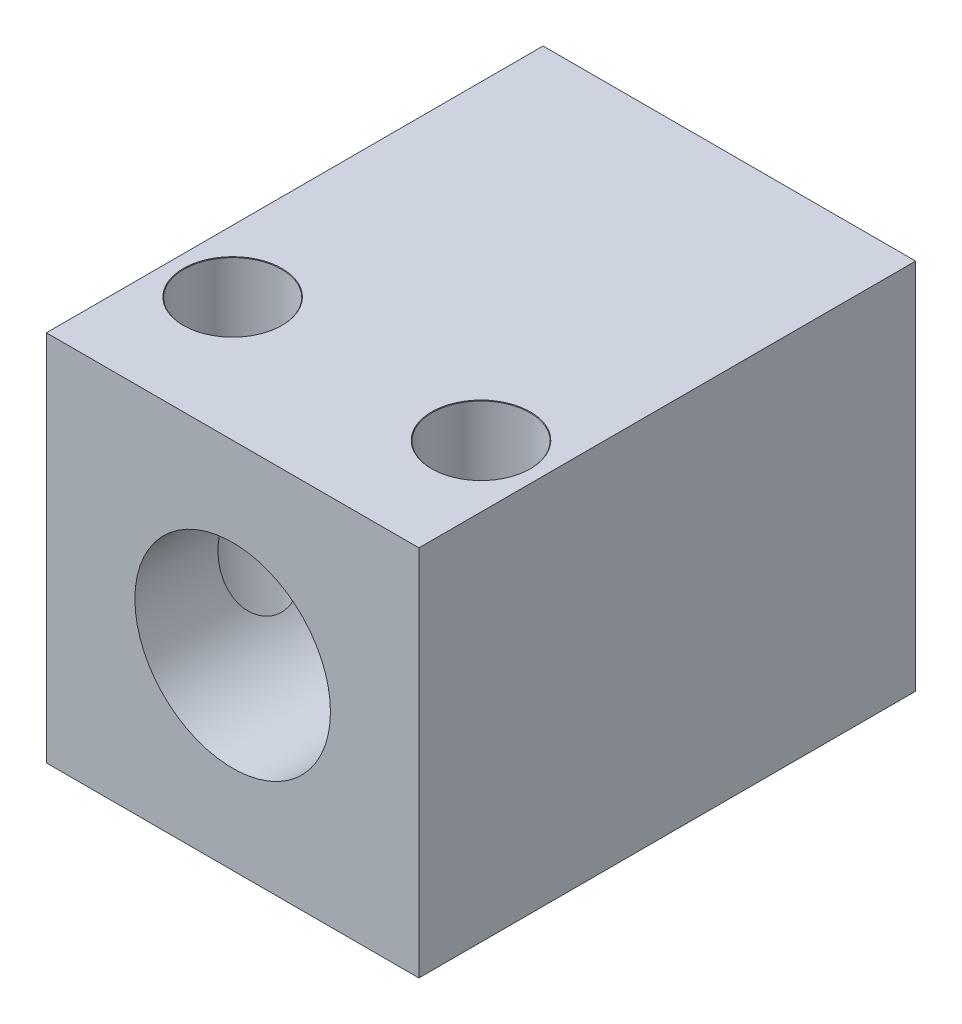
ISO-10303-21;
HEADER;
FILE_DESCRIPTION(('STEP AP214'),'2;1');
FILE_NAME('part.step','',(''),(''),'','','');
FILE_SCHEMA(('AUTOMOTIVE_DESIGN { 1 0 10303 214 1 1 1 1 }'));
ENDSEC;
DATA;
#1=APPLICATION_CONTEXT('core data for automotive mechanical design processes');
#2=APPLICATION_PROTOCOL_DEFINITION('international standard','automotive_design',2000,#1);
#3=PRODUCT_CONTEXT('',#1,'mechanical');
#4=PRODUCT('Part','Part','',(#3));
#5=PRODUCT_RELATED_PRODUCT_CATEGORY('part','',(#4));
#6=PRODUCT_DEFINITION_FORMATION('','',#4);
#7=PRODUCT_DEFINITION_CONTEXT('part definition',#1,'design');
#8=PRODUCT_DEFINITION('design','',#6,#7);
#9=PRODUCT_DEFINITION_SHAPE('','',#8);
#10=(LENGTH_UNIT() NAMED_UNIT(*) SI_UNIT(.MILLI.,.METRE.));
#11=(NAMED_UNIT(*) PLANE_ANGLE_UNIT() SI_UNIT($,.RADIAN.));
#12=(NAMED_UNIT(*) SI_UNIT($,.STERADIAN.) SOLID_ANGLE_UNIT());
#13=UNCERTAINTY_MEASURE_WITH_UNIT(LENGTH_MEASURE(1.E-05),#10,'distance_accuracy_value','');
#14=(GEOMETRIC_REPRESENTATION_CONTEXT(3) GLOBAL_UNCERTAINTY_ASSIGNED_CONTEXT((#13)) GLOBAL_UNIT_ASSIGNED_CONTEXT((#10,
#11,#12)) REPRESENTATION_CONTEXT('',''));
#15=CARTESIAN_POINT('',(0.,0.,0.));
#16=DIRECTION('',(0.,0.,1.));
#17=DIRECTION('',(1.,0.,0.));
#18=AXIS2_PLACEMENT_3D('',#15,#16,#17);
#19=CARTESIAN_POINT('',(0.,93.345,-685.8));
#20=DIRECTION('',(0.,1.,0.));
#21=DIRECTION('',(0.,0.,1.));
#22=AXIS2_PLACEMENT_3D('',#19,#20,#21);
#23=PLANE('',#22);
#24=CARTESIAN_POINT('',(57.15,93.345,-692.15));
#25=DIRECTION('',(0.,1.,0.));
#26=DIRECTION('',(0.,0.,1.));
#27=AXIS2_PLACEMENT_3D('',#24,#25,#26);
#28=CIRCLE('',#27,2.525);
#29=CARTESIAN_POINT('',(57.15,93.345,-689.625));
#30=VERTEX_POINT('',#29);
#31=EDGE_CURVE('E164',#30,#30,#28,.T.);
#32=ORIENTED_EDGE('',*,*,#31,.F.);
#33=EDGE_LOOP('',(#32));
#34=FACE_BOUND('',#33,.T.);
#35=CARTESIAN_POINT('',(69.85,93.345,-692.15));
#36=DIRECTION('',(0.,1.,0.));
#37=DIRECTION('',(0.,0.,1.));
#38=AXIS2_PLACEMENT_3D('',#35,#36,#37);
#39=CIRCLE('',#38,2.525);
#40=CARTESIAN_POINT('',(69.85,93.345,-689.625));
#41=VERTEX_POINT('',#40);
#42=EDGE_CURVE('E176',#41,#41,#39,.T.);
#43=ORIENTED_EDGE('',*,*,#42,.F.);
#44=EDGE_LOOP('',(#43));
#45=FACE_BOUND('',#44,.T.);
#46=DIRECTION('',(1.,0.,0.));
#47=VECTOR('',#46,1.);
#48=CARTESIAN_POINT('',(0.,93.345,-711.2));
#49=LINE('',#48,#47);
#50=CARTESIAN_POINT('',(53.975,93.345,-711.2));
#51=VERTEX_POINT('',#50);
#52=CARTESIAN_POINT('',(73.025,93.345,-711.2));
#53=VERTEX_POINT('',#52);
#54=EDGE_CURVE('E211',#51,#53,#49,.T.);
#55=ORIENTED_EDGE('',*,*,#54,.F.);
#56=DIRECTION('',(0.,0.,-1.));
#57=VECTOR('',#56,1.);
#58=CARTESIAN_POINT('',(53.975,93.345,-685.8));
#59=LINE('',#58,#57);
#60=CARTESIAN_POINT('',(53.975,93.345,-685.8));
#61=VERTEX_POINT('',#60);
#62=EDGE_CURVE('E11',#61,#51,#59,.T.);
#63=ORIENTED_EDGE('',*,*,#62,.F.);
#64=DIRECTION('',(1.,0.,0.));
#65=VECTOR('',#64,1.);
#66=CARTESIAN_POINT('',(0.,93.345,-685.8));
#67=LINE('',#66,#65);
#68=CARTESIAN_POINT('',(73.025,93.345,-685.8));
#69=VERTEX_POINT('',#68);
#70=EDGE_CURVE('E194',#61,#69,#67,.T.);
#71=ORIENTED_EDGE('',*,*,#70,.T.);
#72=DIRECTION('',(0.,0.,-1.));
#73=VECTOR('',#72,1.);
#74=CARTESIAN_POINT('',(73.025,93.345,-685.8));
#75=LINE('',#74,#73);
#76=EDGE_CURVE('E72',#69,#53,#75,.T.);
#77=ORIENTED_EDGE('',*,*,#76,.T.);
#78=EDGE_LOOP('',(#55,#63,#71,#77));
#79=FACE_BOUND('',#78,.T.);
#80=ADVANCED_FACE('F47',(#34,#45,#79),#23,.T.);
#81=CARTESIAN_POINT('',(53.975,0.,-685.8));
#82=DIRECTION('',(1.,0.,0.));
#83=DIRECTION('',(0.,0.,-1.));
#84=AXIS2_PLACEMENT_3D('',#81,#82,#83);
#85=PLANE('',#84);
#86=DIRECTION('',(0.,-1.,0.));
#87=VECTOR('',#86,1.);
#88=CARTESIAN_POINT('',(53.975,0.,-711.2));
#89=LINE('',#88,#87);
#90=CARTESIAN_POINT('',(53.975,74.295,-711.2));
#91=VERTEX_POINT('',#90);
#92=EDGE_CURVE('E214',#51,#91,#89,.T.);
#93=ORIENTED_EDGE('',*,*,#92,.T.);
#94=DIRECTION('',(0.,0.,-1.));
#95=VECTOR('',#94,1.);
#96=CARTESIAN_POINT('',(53.975,74.295,-685.8));
#97=LINE('',#96,#95);
#98=CARTESIAN_POINT('',(53.975,74.295,-685.8));
#99=VERTEX_POINT('',#98);
#100=EDGE_CURVE('E63',#99,#91,#97,.T.);
#101=ORIENTED_EDGE('',*,*,#100,.F.);
#102=DIRECTION('',(0.,-1.,0.));
#103=VECTOR('',#102,1.);
#104=CARTESIAN_POINT('',(53.975,0.,-685.8));
#105=LINE('',#104,#103);
#106=EDGE_CURVE('E198',#61,#99,#105,.T.);
#107=ORIENTED_EDGE('',*,*,#106,.F.);
#108=ORIENTED_EDGE('',*,*,#62,.T.);
#109=EDGE_LOOP('',(#93,#101,#107,#108));
#110=FACE_BOUND('',#109,.T.);
#111=ADVANCED_FACE('F257',(#110),#85,.F.);
#112=CARTESIAN_POINT('',(0.,74.295,-685.8));
#113=DIRECTION('',(0.,1.,0.));
#114=DIRECTION('',(0.,0.,1.));
#115=AXIS2_PLACEMENT_3D('',#112,#113,#114);
#116=PLANE('',#115);
#117=CARTESIAN_POINT('',(57.15,74.295,-692.15));
#118=DIRECTION('',(0.,1.,0.));
#119=DIRECTION('',(0.,0.,1.));
#120=AXIS2_PLACEMENT_3D('',#117,#118,#119);
#121=CIRCLE('',#120,2.49999999999999);
#122=CARTESIAN_POINT('',(57.15,74.295,-689.65));
#123=VERTEX_POINT('',#122);
#124=EDGE_CURVE('E172',#123,#123,#121,.T.);
#125=ORIENTED_EDGE('',*,*,#124,.T.);
#126=EDGE_LOOP('',(#125));
#127=FACE_BOUND('',#126,.T.);
#128=CARTESIAN_POINT('',(69.85,74.295,-692.15));
#129=DIRECTION('',(0.,1.,0.));
#130=DIRECTION('',(0.,0.,1.));
#131=AXIS2_PLACEMENT_3D('',#128,#129,#130);
#132=CIRCLE('',#131,2.49999999999999);
#133=CARTESIAN_POINT('',(69.85,74.295,-689.65));
#134=VERTEX_POINT('',#133);
#135=EDGE_CURVE('E185',#134,#134,#132,.T.);
#136=ORIENTED_EDGE('',*,*,#135,.T.);
#137=EDGE_LOOP('',(#136));
#138=FACE_BOUND('',#137,.T.);
#139=DIRECTION('',(1.,0.,0.));
#140=VECTOR('',#139,1.);
#141=CARTESIAN_POINT('',(0.,74.295,-711.2));
#142=LINE('',#141,#140);
#143=CARTESIAN_POINT('',(73.025,74.295,-711.2));
#144=VERTEX_POINT('',#143);
#145=EDGE_CURVE('E218',#91,#144,#142,.T.);
#146=ORIENTED_EDGE('',*,*,#145,.T.);
#147=DIRECTION('',(0.,0.,-1.));
#148=VECTOR('',#147,1.);
#149=CARTESIAN_POINT('',(73.025,74.295,-685.8));
#150=LINE('',#149,#148);
#151=CARTESIAN_POINT('',(73.025,74.295,-685.8));
#152=VERTEX_POINT('',#151);
#153=EDGE_CURVE('E87',#152,#144,#150,.T.);
#154=ORIENTED_EDGE('',*,*,#153,.F.);
#155=DIRECTION('',(1.,0.,0.));
#156=VECTOR('',#155,1.);
#157=CARTESIAN_POINT('',(0.,74.295,-685.8));
#158=LINE('',#157,#156);
#159=EDGE_CURVE('E202',#99,#152,#158,.T.);
#160=ORIENTED_EDGE('',*,*,#159,.F.);
#161=ORIENTED_EDGE('',*,*,#100,.T.);
#162=EDGE_LOOP('',(#146,#154,#160,#161));
#163=FACE_BOUND('',#162,.T.);
#164=ADVANCED_FACE('F254',(#127,#138,#163),#116,.F.);
#165=CARTESIAN_POINT('',(63.5,83.82,-685.8));
#166=DIRECTION('',(0.,0.,-1.));
#167=DIRECTION('',(-1.,0.,0.));
#168=AXIS2_PLACEMENT_3D('',#165,#166,#167);
#169=CYLINDRICAL_SURFACE('',#168,5.00000000000001);
#170=CARTESIAN_POINT('',(58.5,83.82,-690.04583745875));
#171=CARTESIAN_POINT('',(58.4999989774672,83.714213545151,-690.045839970916));
#172=CARTESIAN_POINT('',(58.5033593214814,83.6084419302891,-690.047982295149));
#173=CARTESIAN_POINT('',(58.5167644076017,83.3974684740138,-690.056671842969));
#174=CARTESIAN_POINT('',(58.5268107384981,83.2922667740209,-690.063220113543));
#175=CARTESIAN_POINT('',(58.5534874476869,83.0830135197032,-690.081067914394));
#176=CARTESIAN_POINT('',(58.5701234824508,82.9789630326395,-690.09237152708));
#177=CARTESIAN_POINT('',(58.6097633373426,82.7728163415862,-690.120300261963));
#178=CARTESIAN_POINT('',(58.6327656053745,82.6707196677327,-690.136924087239));
#179=CARTESIAN_POINT('',(58.6799118026842,82.4881197584404,-690.172610548589));
#180=CARTESIAN_POINT('',(58.7030374058769,82.4071495674642,-690.190635391782));
#181=CARTESIAN_POINT('',(58.7529661046161,82.2475311850245,-690.231266899094));
#182=CARTESIAN_POINT('',(58.7797684642517,82.1688825327184,-690.253872646765));
#183=CARTESIAN_POINT('',(58.8366094270354,82.0145821831999,-690.304251127018));
#184=CARTESIAN_POINT('',(58.8666433361218,81.9389263516115,-690.332016406541));
#185=CARTESIAN_POINT('',(58.9293916836324,81.7912106537287,-690.393387232573));
#186=CARTESIAN_POINT('',(58.9621052462904,81.7191496248688,-690.426990874977));
#187=CARTESIAN_POINT('',(59.0454762702973,81.5461815121693,-690.518249815511));
#188=CARTESIAN_POINT('',(59.097287632407,81.4477964772423,-690.579754737754));
#189=CARTESIAN_POINT('',(59.2016464277976,81.263567652712,-690.718824518529));
#190=CARTESIAN_POINT('',(59.2541927677179,81.1777070383515,-690.79636748705));
#191=CARTESIAN_POINT('',(59.3461720823886,81.035839710185,-690.952713217435));
#192=CARTESIAN_POINT('',(59.3862606531168,80.9772416101752,-691.028765248821));
#193=CARTESIAN_POINT('',(59.4607046829431,80.8724193856106,-691.191545771931));
#194=CARTESIAN_POINT('',(59.4950618080349,80.8261916629152,-691.278271148389));
#195=CARTESIAN_POINT('',(59.5551809861293,80.747395827986,-691.461218165204));
#196=CARTESIAN_POINT('',(59.5808901329381,80.7149114936918,-691.557493753863));
#197=CARTESIAN_POINT('',(59.6208597668046,80.6651128389882,-691.756175704769));
#198=CARTESIAN_POINT('',(59.6351248702689,80.647792401365,-691.858579576997));
#199=CARTESIAN_POINT('',(59.6499051883666,80.6298776217754,-692.054645065697));
#200=CARTESIAN_POINT('',(59.651730720185,80.6276889679153,-692.148066719959));
#201=CARTESIAN_POINT('',(59.6449549876982,80.6358740222636,-692.333955098434));
#202=CARTESIAN_POINT('',(59.6363571086923,80.6462436518109,-692.426422122855));
#203=CARTESIAN_POINT('',(59.6099182716733,80.6787143163069,-692.604583173049));
#204=CARTESIAN_POINT('',(59.5923987564821,80.7004079901533,-692.690400445237));
#205=CARTESIAN_POINT('',(59.5496455782865,80.7547288100059,-692.856438222014));
#206=CARTESIAN_POINT('',(59.5244116259869,80.7873563660429,-692.936658516576));
#207=CARTESIAN_POINT('',(59.4666585971674,80.8645681832631,-693.093623606251));
#208=CARTESIAN_POINT('',(59.4338454473922,80.9096557805827,-693.170010905675));
#209=CARTESIAN_POINT('',(59.3640356400811,81.0097458801378,-693.313808166226));
#210=CARTESIAN_POINT('',(59.3270369773188,81.0647531423207,-693.38121379038));
#211=CARTESIAN_POINT('',(59.235875625208,81.20716369627,-693.531915457981));
#212=CARTESIAN_POINT('',(59.1807817872897,81.2987105074255,-693.610737943689));
#213=CARTESIAN_POINT('',(59.0720314848236,81.4949790961469,-693.751167905875));
#214=CARTESIAN_POINT('',(59.0183781180215,81.5997268777275,-693.812740609303));
#215=CARTESIAN_POINT('',(58.9325077690338,81.784105272211,-693.903631982223));
#216=CARTESIAN_POINT('',(58.8988903189244,81.8611612240619,-693.936986023354));
#217=CARTESIAN_POINT('',(58.8348543558828,82.018983427362,-693.997487461479));
#218=CARTESIAN_POINT('',(58.8044369671571,82.0997509684991,-694.02463268117));
#219=CARTESIAN_POINT('',(58.7473794144433,82.2643023940694,-694.073483987691));
#220=CARTESIAN_POINT('',(58.7207435662942,82.3480895902743,-694.095183881146));
#221=CARTESIAN_POINT('',(58.6716918675943,82.5179776221962,-694.133790932561));
#222=CARTESIAN_POINT('',(58.6492769194497,82.6040789481759,-694.150697066031));
#223=CARTESIAN_POINT('',(58.6035853984843,82.8012242103544,-694.184231850606));
#224=CARTESIAN_POINT('',(58.5816698852162,82.9128026559503,-694.19958691147));
#225=CARTESIAN_POINT('',(58.5454406701975,83.1378408643618,-694.22442156404));
#226=CARTESIAN_POINT('',(58.5311288610601,83.2513010883245,-694.233899693036));
#227=CARTESIAN_POINT('',(58.510303384405,83.4793429381999,-694.24755331324));
#228=CARTESIAN_POINT('',(58.5037961516434,83.5939254110357,-694.251724429068));
#229=CARTESIAN_POINT('',(58.4986850016681,83.8233260536539,-694.255007748858));
#230=CARTESIAN_POINT('',(58.5000803602592,83.938144200875,-694.254120416378));
#231=CARTESIAN_POINT('',(58.5107913837179,84.168028775859,-694.247209658506));
#232=CARTESIAN_POINT('',(58.520159881577,84.2830917406903,-694.241151971644));
#233=CARTESIAN_POINT('',(58.5467639908882,84.5118968503175,-694.223476737594));
#234=CARTESIAN_POINT('',(58.5640008310382,84.6256387859795,-694.211858322046));
#235=CARTESIAN_POINT('',(58.6060604624187,84.8507449122909,-694.18237520407));
#236=CARTESIAN_POINT('',(58.6308725967927,84.9621122095882,-694.16451927147));
#237=CARTESIAN_POINT('',(58.6876069136399,85.1815173537787,-694.121554166188));
#238=CARTESIAN_POINT('',(58.7195256438106,85.2895567883977,-694.096448513585));
#239=CARTESIAN_POINT('',(58.8016094783985,85.5367351377603,-694.027756441576));
#240=CARTESIAN_POINT('',(58.8543050338145,85.6741675886076,-693.980796444577));
#241=CARTESIAN_POINT('',(58.9395907185967,85.8713010469333,-693.896122528397));
#242=CARTESIAN_POINT('',(58.9690473086483,85.9354870091586,-693.865539874803));
#243=CARTESIAN_POINT('',(59.0294633894776,86.0603355712566,-693.799132265868));
#244=CARTESIAN_POINT('',(59.0604225050558,86.1209990425135,-693.763308614814));
#245=CARTESIAN_POINT('',(59.1402094803241,86.2700427326909,-693.664918436814));
#246=CARTESIAN_POINT('',(59.1896087506774,86.3555791856278,-693.59839545348));
#247=CARTESIAN_POINT('',(59.2868042202156,86.5139967190672,-693.450708905244));
#248=CARTESIAN_POINT('',(59.3346021972436,86.5868922371289,-693.369562261428));
#249=CARTESIAN_POINT('',(59.4170436193557,86.7068503277276,-693.207081080405));
#250=CARTESIAN_POINT('',(59.4525662724168,86.7561821612061,-693.127876660806));
#251=CARTESIAN_POINT('',(59.5166881564435,86.8426034192136,-692.960436256832));
#252=CARTESIAN_POINT('',(59.5452892636058,86.8796961623387,-692.87220272919));
#253=CARTESIAN_POINT('',(59.5931969934928,86.9406437852158,-692.688372880791));
#254=CARTESIAN_POINT('',(59.6124601283686,86.9644368040265,-692.592744470478));
#255=CARTESIAN_POINT('',(59.6396720433219,86.9977893947113,-692.397463440464));
#256=CARTESIAN_POINT('',(59.6476236244352,87.0073524903124,-692.297811823302));
#257=CARTESIAN_POINT('',(59.6512961330691,87.0117826361869,-692.106449973319));
#258=CARTESIAN_POINT('',(59.6479966915149,87.0078267239654,-692.014782623162));
#259=CARTESIAN_POINT('',(59.6315739788198,86.9878770915603,-691.833691141505));
#260=CARTESIAN_POINT('',(59.6184530415509,86.9718862312242,-691.744266482293));
#261=CARTESIAN_POINT('',(59.5836544940618,86.9285349613674,-691.571181494822));
#262=CARTESIAN_POINT('',(59.56208214742,86.901314208661,-691.487464589249));
#263=CARTESIAN_POINT('',(59.5119957730343,86.8362065350911,-691.326540789541));
#264=CARTESIAN_POINT('',(59.4834807264435,86.7983180486012,-691.249334853136));
#265=CARTESIAN_POINT('',(59.4193641714341,86.7099091023834,-691.097757410084));
#266=CARTESIAN_POINT('',(59.3834127900791,86.6587052211797,-691.023935009921));
#267=CARTESIAN_POINT('',(59.3083243906476,86.5466131834455,-690.885951069921));
#268=CARTESIAN_POINT('',(59.269185881661,86.4857204817171,-690.821794091944));
#269=CARTESIAN_POINT('',(59.1720326716807,86.3261651450212,-690.67617707448));
#270=CARTESIAN_POINT('',(59.1135142894916,86.2229049079471,-690.600082857873));
#271=CARTESIAN_POINT('',(59.0001034406118,86.0031838871528,-690.466293779107));
#272=CARTESIAN_POINT('',(58.9452203489707,85.886690927087,-690.408645124994));
#273=CARTESIAN_POINT('',(58.8589589797964,85.682501251587,-690.324668521492));
#274=CARTESIAN_POINT('',(58.8256179020835,85.5972743543517,-690.294192685601));
#275=CARTESIAN_POINT('',(58.7631194800053,85.4232782528053,-690.239614749445));
#276=CARTESIAN_POINT('',(58.7339638387801,85.3345076251508,-690.215515240494));
#277=CARTESIAN_POINT('',(58.6803932249847,85.154255176474,-690.172863602071));
#278=CARTESIAN_POINT('',(58.6559786272353,85.0627731417498,-690.154311911139));
#279=CARTESIAN_POINT('',(58.6122499730436,84.8777975312691,-690.122055528752));
#280=CARTESIAN_POINT('',(58.5929348143633,84.7843043949426,-690.108349789632));
#281=CARTESIAN_POINT('',(58.5510485535218,84.5472498156532,-690.0792442242));
#282=CARTESIAN_POINT('',(58.5319313579885,84.4027217441802,-690.066612911881));
#283=CARTESIAN_POINT('',(58.5064094948938,84.1121194029039,-690.049908944843));
#284=CARTESIAN_POINT('',(58.5000014116777,83.9660455591497,-690.04583399053));
#285=CARTESIAN_POINT('',(58.5,83.82,-690.04583745875));
#286=B_SPLINE_CURVE_WITH_KNOTS('',3,(#170,#171,#172,#173,#174,#175,#176,#177,#178,#179,#180,
#181,#182,#183,#184,#185,#186,#187,#188,#189,#190,#191,#192,#193,#194,#195,#196,#197,#198,#199,
#200,#201,#202,#203,#204,#205,#206,#207,#208,#209,#210,#211,#212,#213,#214,#215,#216,#217,#218,
#219,#220,#221,#222,#223,#224,#225,#226,#227,#228,#229,#230,#231,#232,#233,#234,#235,#236,#237,
#238,#239,#240,#241,#242,#243,#244,#245,#246,#247,#248,#249,#250,#251,#252,#253,#254,#255,#256,
#257,#258,#259,#260,#261,#262,#263,#264,#265,#266,#267,#268,#269,#270,#271,#272,#273,#274,#275,
#276,#277,#278,#279,#280,#281,#282,#283,#284,#285),.UNSPECIFIED.,.T.,.F.,(4,2,2,2,2,2,2,2,2,2,2,
2,2,2,2,2,2,2,2,2,2,2,2,2,2,2,2,2,2,2,2,2,2,2,2,2,2,2,2,2,2,2,2,2,2,2,2,2,2,2,2,2,2,2,2,2,2,4),
(0.,0.317258235883728,0.634591888746754,0.952198526888585,1.26972780022549,1.52786381465381,
1.78594823777528,2.04366271012561,2.30129328955168,2.68107140577116,3.0603345511363,
3.37118001327778,3.68193496205928,3.9945578526186,4.30705457089512,4.58604400067478,
4.86494284496378,5.13443750190509,5.4039422662749,5.68652365571792,5.9692410042958,
6.36537779969136,6.76230749554695,7.03330669570622,7.30440078430067,7.5758018249172,
7.84726082393612,8.19103235537568,8.5348894138239,8.87902978278737,9.22313861516351,
9.56954555495847,9.91600660718971,10.2619824895704,10.6077906661439,11.0694451194874,
11.3000973188883,11.5306922149423,11.8865448150107,12.2419882701976,12.5402530983816,
12.8384369862838,13.1379965139888,13.437481850024,13.7115804166029,13.9856138700903,
14.2563374849802,14.5271008527502,14.8162632321483,15.1055616648889,15.5261848640486,
15.9478536646856,16.2368707634322,16.5260051378106,16.8151623614817,17.1042570328842,
17.5423718572834,17.9803689195787),.UNSPECIFIED.);
#287=CARTESIAN_POINT('',(58.5,83.82,-690.04583745875));
#288=VERTEX_POINT('',#287);
#289=EDGE_CURVE('E52',#288,#288,#286,.T.);
#290=ORIENTED_EDGE('',*,*,#289,.F.);
#291=EDGE_LOOP('',(#290));
#292=FACE_BOUND('',#291,.T.);
#293=CARTESIAN_POINT('',(68.5,83.82,-690.04583745875));
#294=CARTESIAN_POINT('',(68.5000010225328,83.925786454849,-690.045839970916));
#295=CARTESIAN_POINT('',(68.4966406785186,84.0315580697109,-690.047982295149));
#296=CARTESIAN_POINT('',(68.4832355923984,84.2425315259862,-690.056671842969));
#297=CARTESIAN_POINT('',(68.4731892615019,84.3477332259791,-690.063220113543));
#298=CARTESIAN_POINT('',(68.4465125523131,84.5569864802967,-690.081067914394));
#299=CARTESIAN_POINT('',(68.4298765175492,84.6610369673604,-690.09237152708));
#300=CARTESIAN_POINT('',(68.3902366626574,84.8671836584137,-690.120300261963));
#301=CARTESIAN_POINT('',(68.3672343946255,84.9692803322673,-690.136924087239));
#302=CARTESIAN_POINT('',(68.3200881973158,85.1518802415596,-690.172610548589));
#303=CARTESIAN_POINT('',(68.2969625941231,85.2328504325358,-690.190635391782));
#304=CARTESIAN_POINT('',(68.247033895384,85.3924688149755,-690.231266899094));
#305=CARTESIAN_POINT('',(68.2202315357484,85.4711174672816,-690.253872646765));
#306=CARTESIAN_POINT('',(68.1633905729646,85.6254178168001,-690.304251127018));
#307=CARTESIAN_POINT('',(68.1333566638782,85.7010736483884,-690.332016406541));
#308=CARTESIAN_POINT('',(68.0706083163676,85.8487893462713,-690.393387232573));
#309=CARTESIAN_POINT('',(68.0378947537096,85.9208503751311,-690.426990874977));
#310=CARTESIAN_POINT('',(67.9545237297026,86.0938184878306,-690.518249815511));
#311=CARTESIAN_POINT('',(67.902712367593,86.1922035227577,-690.579754737754));
#312=CARTESIAN_POINT('',(67.7983535722023,86.376432347288,-690.718824518529));
#313=CARTESIAN_POINT('',(67.7458072322821,86.4622929616485,-690.79636748705));
#314=CARTESIAN_POINT('',(67.6538279176114,86.604160289815,-690.952713217435));
#315=CARTESIAN_POINT('',(67.6137393468832,86.6627583898247,-691.028765248821));
#316=CARTESIAN_POINT('',(67.539295317057,86.7675806143893,-691.191545771931));
#317=CARTESIAN_POINT('',(67.5049381919651,86.8138083370847,-691.278271148389));
#318=CARTESIAN_POINT('',(67.4448190138707,86.892604172014,-691.461218165204));
#319=CARTESIAN_POINT('',(67.4191098670619,86.9250885063082,-691.557493753863));
#320=CARTESIAN_POINT('',(67.3791402331954,86.9748871610118,-691.756175704769));
#321=CARTESIAN_POINT('',(67.3648751297311,86.992207598635,-691.858579576997));
#322=CARTESIAN_POINT('',(67.3500948116334,87.0101223782246,-692.054645065697));
#323=CARTESIAN_POINT('',(67.348269279815,87.0123110320847,-692.148066719959));
#324=CARTESIAN_POINT('',(67.3550450123019,87.0041259777364,-692.333955098434));
#325=CARTESIAN_POINT('',(67.3636428913077,86.9937563481891,-692.426422122855));
#326=CARTESIAN_POINT('',(67.3900817283267,86.9612856836931,-692.604583173049));
#327=CARTESIAN_POINT('',(67.407601243518,86.9395920098467,-692.690400445237));
#328=CARTESIAN_POINT('',(67.4503544217135,86.885271189994,-692.856438222014));
#329=CARTESIAN_POINT('',(67.4755883740132,86.8526436339571,-692.936658516576));
#330=CARTESIAN_POINT('',(67.5333414028326,86.7754318167368,-693.093623606251));
#331=CARTESIAN_POINT('',(67.5661545526078,86.7303442194173,-693.170010905675));
#332=CARTESIAN_POINT('',(67.6359643599189,86.6302541198622,-693.313808166226));
#333=CARTESIAN_POINT('',(67.6729630226812,86.5752468576793,-693.38121379038));
#334=CARTESIAN_POINT('',(67.764124374792,86.43283630373,-693.531915457981));
#335=CARTESIAN_POINT('',(67.8192182127103,86.3412894925745,-693.610737943689));
#336=CARTESIAN_POINT('',(67.9279685151764,86.1450209038531,-693.751167905875));
#337=CARTESIAN_POINT('',(67.9816218819785,86.0402731222725,-693.812740609303));
#338=CARTESIAN_POINT('',(68.0674922309662,85.8558947277889,-693.903631982223));
#339=CARTESIAN_POINT('',(68.1011096810756,85.7788387759381,-693.936986023354));
#340=CARTESIAN_POINT('',(68.1651456441172,85.621016572638,-693.997487461479));
#341=CARTESIAN_POINT('',(68.195563032843,85.5402490315009,-694.02463268117));
#342=CARTESIAN_POINT('',(68.2526205855567,85.3756976059305,-694.073483987691));
#343=CARTESIAN_POINT('',(68.2792564337058,85.2919104097257,-694.095183881146));
#344=CARTESIAN_POINT('',(68.3283081324057,85.1220223778038,-694.133790932561));
#345=CARTESIAN_POINT('',(68.3507230805503,85.035921051824,-694.150697066031));
#346=CARTESIAN_POINT('',(68.3964146015157,84.8387757896455,-694.184231850606));
#347=CARTESIAN_POINT('',(68.4183301147838,84.7271973440497,-694.19958691147));
#348=CARTESIAN_POINT('',(68.4545593298025,84.5021591356382,-694.22442156404));
#349=CARTESIAN_POINT('',(68.4688711389399,84.3886989116755,-694.233899693036));
#350=CARTESIAN_POINT('',(68.489696615595,84.1606570618001,-694.24755331324));
#351=CARTESIAN_POINT('',(68.4962038483566,84.0460745889643,-694.251724429068));
#352=CARTESIAN_POINT('',(68.5013149983319,83.8166739463461,-694.255007748858));
#353=CARTESIAN_POINT('',(68.4999196397408,83.7018557991249,-694.254120416378));
#354=CARTESIAN_POINT('',(68.4892086162821,83.4719712241409,-694.247209658506));
#355=CARTESIAN_POINT('',(68.479840118423,83.3569082593097,-694.241151971644));
#356=CARTESIAN_POINT('',(68.4532360091118,83.1281031496825,-694.223476737594));
#357=CARTESIAN_POINT('',(68.4359991689617,83.0143612140204,-694.211858322046));
#358=CARTESIAN_POINT('',(68.3939395375813,82.7892550877091,-694.18237520407));
#359=CARTESIAN_POINT('',(68.3691274032073,82.6778877904118,-694.16451927147));
#360=CARTESIAN_POINT('',(68.3123930863601,82.4584826462213,-694.121554166188));
#361=CARTESIAN_POINT('',(68.2804743561894,82.3504432116023,-694.096448513585));
#362=CARTESIAN_POINT('',(68.1983905216015,82.1032648622397,-694.027756441576));
#363=CARTESIAN_POINT('',(68.1456949661856,81.9658324113924,-693.980796444577));
#364=CARTESIAN_POINT('',(68.0604092814033,81.7686989530667,-693.896122528397));
#365=CARTESIAN_POINT('',(68.0309526913517,81.7045129908414,-693.865539874803));
#366=CARTESIAN_POINT('',(67.9705366105224,81.5796644287434,-693.799132265868));
#367=CARTESIAN_POINT('',(67.9395774949442,81.5190009574865,-693.763308614814));
#368=CARTESIAN_POINT('',(67.8597905196759,81.3699572673091,-693.664918436814));
#369=CARTESIAN_POINT('',(67.8103912493226,81.2844208143722,-693.59839545348));
#370=CARTESIAN_POINT('',(67.7131957797844,81.1260032809328,-693.450708905244));
#371=CARTESIAN_POINT('',(67.6653978027565,81.0531077628711,-693.369562261428));
#372=CARTESIAN_POINT('',(67.5829563806443,80.9331496722724,-693.207081080405));
#373=CARTESIAN_POINT('',(67.5474337275832,80.8838178387939,-693.127876660806));
#374=CARTESIAN_POINT('',(67.4833118435565,80.7973965807864,-692.960436256832));
#375=CARTESIAN_POINT('',(67.4547107363942,80.7603038376613,-692.87220272919));
#376=CARTESIAN_POINT('',(67.4068030065072,80.6993562147842,-692.688372880791));
#377=CARTESIAN_POINT('',(67.3875398716314,80.6755631959735,-692.592744470478));
#378=CARTESIAN_POINT('',(67.3603279566781,80.6422106052887,-692.397463440464));
#379=CARTESIAN_POINT('',(67.3523763755649,80.6326475096875,-692.297811823302));
#380=CARTESIAN_POINT('',(67.3487038669309,80.6282173638131,-692.106449973319));
#381=CARTESIAN_POINT('',(67.3520033084851,80.6321732760346,-692.014782623162));
#382=CARTESIAN_POINT('',(67.3684260211802,80.6521229084397,-691.833691141505));
#383=CARTESIAN_POINT('',(67.3815469584491,80.6681137687758,-691.744266482293));
#384=CARTESIAN_POINT('',(67.4163455059382,80.7114650386326,-691.571181494822));
#385=CARTESIAN_POINT('',(67.43791785258,80.738685791339,-691.487464589249));
#386=CARTESIAN_POINT('',(67.4880042269658,80.803793464909,-691.326540789541));
#387=CARTESIAN_POINT('',(67.5165192735565,80.8416819513988,-691.249334853136));
#388=CARTESIAN_POINT('',(67.5806358285659,80.9300908976166,-691.097757410084));
#389=CARTESIAN_POINT('',(67.6165872099209,80.9812947788203,-691.023935009921));
#390=CARTESIAN_POINT('',(67.6916756093524,81.0933868165545,-690.885951069921));
#391=CARTESIAN_POINT('',(67.730814118339,81.1542795182829,-690.821794091944));
#392=CARTESIAN_POINT('',(67.8279673283193,81.3138348549788,-690.67617707448));
#393=CARTESIAN_POINT('',(67.8864857105084,81.4170950920529,-690.600082857873));
#394=CARTESIAN_POINT('',(67.9998965593883,81.6368161128472,-690.466293779107));
#395=CARTESIAN_POINT('',(68.0547796510293,81.753309072913,-690.408645124994));
#396=CARTESIAN_POINT('',(68.1410410202036,81.957498748413,-690.324668521492));
#397=CARTESIAN_POINT('',(68.1743820979165,82.0427256456483,-690.294192685601));
#398=CARTESIAN_POINT('',(68.2368805199947,82.2167217471947,-690.239614749445));
#399=CARTESIAN_POINT('',(68.2660361612199,82.3054923748492,-690.215515240494));
#400=CARTESIAN_POINT('',(68.3196067750153,82.485744823526,-690.172863602071));
#401=CARTESIAN_POINT('',(68.3440213727648,82.5772268582502,-690.154311911139));
#402=CARTESIAN_POINT('',(68.3877500269565,82.7622024687309,-690.122055528752));
#403=CARTESIAN_POINT('',(68.4070651856367,82.8556956050574,-690.108349789632));
#404=CARTESIAN_POINT('',(68.4489514464782,83.0927501843468,-690.0792442242));
#405=CARTESIAN_POINT('',(68.4680686420115,83.2372782558198,-690.066612911881));
#406=CARTESIAN_POINT('',(68.4935905051062,83.527880597096,-690.049908944843));
#407=CARTESIAN_POINT('',(68.4999985883223,83.6739544408503,-690.04583399053));
#408=CARTESIAN_POINT('',(68.5,83.82,-690.04583745875));
#409=B_SPLINE_CURVE_WITH_KNOTS('',3,(#293,#294,#295,#296,#297,#298,#299,#300,#301,#302,#303,
#304,#305,#306,#307,#308,#309,#310,#311,#312,#313,#314,#315,#316,#317,#318,#319,#320,#321,#322,
#323,#324,#325,#326,#327,#328,#329,#330,#331,#332,#333,#334,#335,#336,#337,#338,#339,#340,#341,
#342,#343,#344,#345,#346,#347,#348,#349,#350,#351,#352,#353,#354,#355,#356,#357,#358,#359,#360,
#361,#362,#363,#364,#365,#366,#367,#368,#369,#370,#371,#372,#373,#374,#375,#376,#377,#378,#379,
#380,#381,#382,#383,#384,#385,#386,#387,#388,#389,#390,#391,#392,#393,#394,#395,#396,#397,#398,
#399,#400,#401,#402,#403,#404,#405,#406,#407,#408),.UNSPECIFIED.,.T.,.F.,(4,2,2,2,2,2,2,2,2,2,2,
2,2,2,2,2,2,2,2,2,2,2,2,2,2,2,2,2,2,2,2,2,2,2,2,2,2,2,2,2,2,2,2,2,2,2,2,2,2,2,2,2,2,2,2,2,2,4),
(0.,0.317258235883726,0.634591888746752,0.952198526888568,1.26972780022548,1.5278638146538,
1.78594823777526,2.04366271012558,2.30129328955168,2.68107140577115,3.06033455113628,
3.37118001327764,3.68193496205927,3.99455785261859,4.30705457089511,4.58604400067477,
4.86494284496377,5.13443750190519,5.40394226627489,5.68652365571791,5.9692410042958,
6.36537779969126,6.76230749554694,7.03330669570616,7.30440078430066,7.57580182491719,
7.8472608239361,8.19103235537569,8.53488941382386,8.87902978278731,9.22313861516351,
9.56954555495844,9.91600660718968,10.2619824895704,10.6077906661439,11.0694451194874,
11.3000973188883,11.5306922149422,11.8865448150106,12.2419882701975,12.5402530983816,
12.8384369862838,13.1379965139887,13.437481850024,13.7115804166029,13.9856138700902,
14.2563374849803,14.5271008527502,14.8162632321482,15.1055616648889,15.5261848640486,
15.9478536646856,16.2368707634322,16.5260051378106,16.8151623614817,17.1042570328842,
17.5423718572834,17.9803689195786),.UNSPECIFIED.);
#410=CARTESIAN_POINT('',(68.5,83.82,-690.04583745875));
#411=VERTEX_POINT('',#410);
#412=EDGE_CURVE('E184',#411,#411,#409,.T.);
#413=ORIENTED_EDGE('',*,*,#412,.F.);
#414=EDGE_LOOP('',(#413));
#415=FACE_BOUND('',#414,.T.);
#416=CARTESIAN_POINT('',(63.5,83.82,-685.8));
#417=DIRECTION('',(0.,0.,1.));
#418=DIRECTION('',(1.,0.,0.));
#419=AXIS2_PLACEMENT_3D('',#416,#417,#418);
#420=CIRCLE('',#419,5.00000000000001);
#421=CARTESIAN_POINT('',(68.5,83.82,-685.8));
#422=VERTEX_POINT('',#421);
#423=EDGE_CURVE('E190',#422,#422,#420,.T.);
#424=ORIENTED_EDGE('',*,*,#423,.T.);
#425=EDGE_LOOP('',(#424));
#426=FACE_BOUND('',#425,.T.);
#427=CARTESIAN_POINT('',(63.5,83.82,-711.2));
#428=DIRECTION('',(0.,0.,1.));
#429=DIRECTION('',(1.,0.,0.));
#430=AXIS2_PLACEMENT_3D('',#427,#428,#429);
#431=CIRCLE('',#430,5.00000000000001);
#432=CARTESIAN_POINT('',(68.5,83.82,-711.2));
#433=VERTEX_POINT('',#432);
#434=EDGE_CURVE('E189',#433,#433,#431,.T.);
#435=ORIENTED_EDGE('',*,*,#434,.F.);
#436=EDGE_LOOP('',(#435));
#437=FACE_BOUND('',#436,.T.);
#438=ADVANCED_FACE('F49',(#292,#415,#426,#437),#169,.F.);
#439=CARTESIAN_POINT('',(73.025,0.,-685.8));
#440=DIRECTION('',(1.,0.,0.));
#441=DIRECTION('',(0.,0.,-1.));
#442=AXIS2_PLACEMENT_3D('',#439,#440,#441);
#443=PLANE('',#442);
#444=DIRECTION('',(0.,-1.,0.));
#445=VECTOR('',#444,1.);
#446=CARTESIAN_POINT('',(73.025,0.,-711.2));
#447=LINE('',#446,#445);
#448=EDGE_CURVE('E195',#53,#144,#447,.T.);
#449=ORIENTED_EDGE('',*,*,#448,.F.);
#450=ORIENTED_EDGE('',*,*,#76,.F.);
#451=DIRECTION('',(0.,-1.,0.));
#452=VECTOR('',#451,1.);
#453=CARTESIAN_POINT('',(73.025,0.,-685.8));
#454=LINE('',#453,#452);
#455=EDGE_CURVE('E205',#69,#152,#454,.T.);
#456=ORIENTED_EDGE('',*,*,#455,.T.);
#457=ORIENTED_EDGE('',*,*,#153,.T.);
#458=EDGE_LOOP('',(#449,#450,#456,#457));
#459=FACE_BOUND('',#458,.T.);
#460=ADVANCED_FACE('F247',(#459),#443,.T.);
#461=CARTESIAN_POINT('',(0.,0.,-685.8));
#462=DIRECTION('',(0.,0.,1.));
#463=DIRECTION('',(1.,0.,0.));
#464=AXIS2_PLACEMENT_3D('',#461,#462,#463);
#465=PLANE('',#464);
#466=ORIENTED_EDGE('',*,*,#423,.F.);
#467=EDGE_LOOP('',(#466));
#468=FACE_BOUND('',#467,.T.);
#469=ORIENTED_EDGE('',*,*,#70,.F.);
#470=ORIENTED_EDGE('',*,*,#106,.T.);
#471=ORIENTED_EDGE('',*,*,#159,.T.);
#472=ORIENTED_EDGE('',*,*,#455,.F.);
#473=EDGE_LOOP('',(#469,#470,#471,#472));
#474=FACE_BOUND('',#473,.T.);
#475=ADVANCED_FACE('F244',(#468,#474),#465,.T.);
#476=CARTESIAN_POINT('',(0.,0.,-711.2));
#477=DIRECTION('',(0.,0.,1.));
#478=DIRECTION('',(1.,0.,0.));
#479=AXIS2_PLACEMENT_3D('',#476,#477,#478);
#480=PLANE('',#479);
#481=CARTESIAN_POINT('',(58.42,78.74,-711.2));
#482=DIRECTION('',(0.,0.,-1.));
#483=DIRECTION('',(-1.,0.,0.));
#484=AXIS2_PLACEMENT_3D('',#481,#482,#483);
#485=CIRCLE('',#484,1.525);
#486=CARTESIAN_POINT('',(56.895,78.74,-711.2));
#487=VERTEX_POINT('',#486);
#488=EDGE_CURVE('E129',#487,#487,#485,.T.);
#489=ORIENTED_EDGE('',*,*,#488,.F.);
#490=EDGE_LOOP('',(#489));
#491=FACE_BOUND('',#490,.T.);
#492=CARTESIAN_POINT('',(68.58,78.74,-711.2));
#493=DIRECTION('',(0.,0.,-1.));
#494=DIRECTION('',(-1.,0.,0.));
#495=AXIS2_PLACEMENT_3D('',#492,#493,#494);
#496=CIRCLE('',#495,1.525);
#497=CARTESIAN_POINT('',(67.055,78.74,-711.2));
#498=VERTEX_POINT('',#497);
#499=EDGE_CURVE('E120',#498,#498,#496,.T.);
#500=ORIENTED_EDGE('',*,*,#499,.F.);
#501=EDGE_LOOP('',(#500));
#502=FACE_BOUND('',#501,.T.);
#503=CARTESIAN_POINT('',(58.42,88.9,-711.2));
#504=DIRECTION('',(0.,0.,-1.));
#505=DIRECTION('',(-1.,0.,0.));
#506=AXIS2_PLACEMENT_3D('',#503,#504,#505);
#507=CIRCLE('',#506,1.525);
#508=CARTESIAN_POINT('',(56.895,88.9,-711.2));
#509=VERTEX_POINT('',#508);
#510=EDGE_CURVE('E140',#509,#509,#507,.T.);
#511=ORIENTED_EDGE('',*,*,#510,.F.);
#512=EDGE_LOOP('',(#511));
#513=FACE_BOUND('',#512,.T.);
#514=CARTESIAN_POINT('',(68.58,88.9,-711.2));
#515=DIRECTION('',(0.,0.,-1.));
#516=DIRECTION('',(-1.,0.,0.));
#517=AXIS2_PLACEMENT_3D('',#514,#515,#516);
#518=CIRCLE('',#517,1.525);
#519=CARTESIAN_POINT('',(67.055,88.9,-711.2));
#520=VERTEX_POINT('',#519);
#521=EDGE_CURVE('E152',#520,#520,#518,.T.);
#522=ORIENTED_EDGE('',*,*,#521,.F.);
#523=EDGE_LOOP('',(#522));
#524=FACE_BOUND('',#523,.T.);
#525=ORIENTED_EDGE('',*,*,#434,.T.);
#526=EDGE_LOOP('',(#525));
#527=FACE_BOUND('',#526,.T.);
#528=ORIENTED_EDGE('',*,*,#54,.T.);
#529=ORIENTED_EDGE('',*,*,#448,.T.);
#530=ORIENTED_EDGE('',*,*,#145,.F.);
#531=ORIENTED_EDGE('',*,*,#92,.F.);
#532=EDGE_LOOP('',(#528,#529,#530,#531));
#533=FACE_BOUND('',#532,.T.);
#534=ADVANCED_FACE('F242',(#491,#502,#513,#524,#527,#533),#480,.F.);
#535=CARTESIAN_POINT('',(69.85,93.345,-692.15));
#536=DIRECTION('',(0.,1.,0.));
#537=DIRECTION('',(0.,0.,1.));
#538=AXIS2_PLACEMENT_3D('',#535,#536,#537);
#539=CYLINDRICAL_SURFACE('',#538,2.49999999999999);
#540=CARTESIAN_POINT('',(69.85,93.32,-692.15));
#541=DIRECTION('',(0.,1.,0.));
#542=DIRECTION('',(0.,0.,1.));
#543=AXIS2_PLACEMENT_3D('',#540,#541,#542);
#544=CIRCLE('',#543,2.49999999999999);
#545=CARTESIAN_POINT('',(69.85,93.32,-689.65));
#546=VERTEX_POINT('',#545);
#547=EDGE_CURVE('E180',#546,#546,#544,.T.);
#548=ORIENTED_EDGE('',*,*,#547,.T.);
#549=EDGE_LOOP('',(#548));
#550=FACE_BOUND('',#549,.T.);
#551=ORIENTED_EDGE('',*,*,#412,.T.);
#552=EDGE_LOOP('',(#551));
#553=FACE_BOUND('',#552,.T.);
#554=ORIENTED_EDGE('',*,*,#135,.F.);
#555=EDGE_LOOP('',(#554));
#556=FACE_BOUND('',#555,.T.);
#557=ADVANCED_FACE('F236',(#550,#553,#556),#539,.F.);
#558=CARTESIAN_POINT('',(69.85,93.345,-692.15));
#559=DIRECTION('',(0.,1.,0.));
#560=DIRECTION('',(0.,0.,1.));
#561=AXIS2_PLACEMENT_3D('',#558,#559,#560);
#562=CONICAL_SURFACE('',#561,2.525,0.785398163397448);
#563=ORIENTED_EDGE('',*,*,#547,.F.);
#564=EDGE_LOOP('',(#563));
#565=FACE_BOUND('',#564,.T.);
#566=ORIENTED_EDGE('',*,*,#42,.T.);
#567=EDGE_LOOP('',(#566));
#568=FACE_BOUND('',#567,.T.);
#569=ADVANCED_FACE('F241',(#565,#568),#562,.F.);
#570=CARTESIAN_POINT('',(57.15,93.345,-692.15));
#571=DIRECTION('',(0.,1.,0.));
#572=DIRECTION('',(0.,0.,1.));
#573=AXIS2_PLACEMENT_3D('',#570,#571,#572);
#574=CYLINDRICAL_SURFACE('',#573,2.49999999999999);
#575=CARTESIAN_POINT('',(57.15,93.32,-692.15));
#576=DIRECTION('',(0.,1.,0.));
#577=DIRECTION('',(0.,0.,1.));
#578=AXIS2_PLACEMENT_3D('',#575,#576,#577);
#579=CIRCLE('',#578,2.49999999999999);
#580=CARTESIAN_POINT('',(57.15,93.32,-689.65));
#581=VERTEX_POINT('',#580);
#582=EDGE_CURVE('E168',#581,#581,#579,.T.);
#583=ORIENTED_EDGE('',*,*,#582,.T.);
#584=EDGE_LOOP('',(#583));
#585=FACE_BOUND('',#584,.T.);
#586=ORIENTED_EDGE('',*,*,#289,.T.);
#587=EDGE_LOOP('',(#586));
#588=FACE_BOUND('',#587,.T.);
#589=ORIENTED_EDGE('',*,*,#124,.F.);
#590=EDGE_LOOP('',(#589));
#591=FACE_BOUND('',#590,.T.);
#592=ADVANCED_FACE('F277',(#585,#588,#591),#574,.F.);
#593=CARTESIAN_POINT('',(57.15,93.345,-692.15));
#594=DIRECTION('',(0.,1.,0.));
#595=DIRECTION('',(0.,0.,1.));
#596=AXIS2_PLACEMENT_3D('',#593,#594,#595);
#597=CONICAL_SURFACE('',#596,2.525,0.785398163397448);
#598=ORIENTED_EDGE('',*,*,#582,.F.);
#599=EDGE_LOOP('',(#598));
#600=FACE_BOUND('',#599,.T.);
#601=ORIENTED_EDGE('',*,*,#31,.T.);
#602=EDGE_LOOP('',(#601));
#603=FACE_BOUND('',#602,.T.);
#604=ADVANCED_FACE('F282',(#600,#603),#597,.F.);
#605=CARTESIAN_POINT('',(68.58,88.9,-698.5));
#606=DIRECTION('',(0.,0.,-1.));
#607=DIRECTION('',(-1.,0.,0.));
#608=AXIS2_PLACEMENT_3D('',#605,#606,#607);
#609=CONICAL_SURFACE('',#608,1.5,1.02974425867668);
#610=CARTESIAN_POINT('',(68.58,88.9,-697.598709071459));
#611=VERTEX_POINT('',#610);
#612=VERTEX_LOOP('',#611);
#613=FACE_BOUND('',#612,.T.);
#614=CARTESIAN_POINT('',(68.58,88.9,-698.5));
#615=DIRECTION('',(0.,0.,-1.));
#616=DIRECTION('',(-1.,0.,0.));
#617=AXIS2_PLACEMENT_3D('',#614,#615,#616);
#618=CIRCLE('',#617,1.5);
#619=CARTESIAN_POINT('',(67.08,88.9,-698.5));
#620=VERTEX_POINT('',#619);
#621=EDGE_CURVE('E160',#620,#620,#618,.T.);
#622=ORIENTED_EDGE('',*,*,#621,.T.);
#623=EDGE_LOOP('',(#622));
#624=FACE_BOUND('',#623,.T.);
#625=ADVANCED_FACE('F339',(#613,#624),#609,.F.);
#626=CARTESIAN_POINT('',(68.58,88.9,-711.2));
#627=DIRECTION('',(0.,0.,-1.));
#628=DIRECTION('',(-1.,0.,0.));
#629=AXIS2_PLACEMENT_3D('',#626,#627,#628);
#630=CYLINDRICAL_SURFACE('',#629,1.5);
#631=ORIENTED_EDGE('',*,*,#621,.F.);
#632=EDGE_LOOP('',(#631));
#633=FACE_BOUND('',#632,.T.);
#634=CARTESIAN_POINT('',(68.58,88.9,-711.175));
#635=DIRECTION('',(0.,0.,-1.));
#636=DIRECTION('',(-1.,0.,0.));
#637=AXIS2_PLACEMENT_3D('',#634,#635,#636);
#638=CIRCLE('',#637,1.5);
#639=CARTESIAN_POINT('',(67.08,88.9,-711.175));
#640=VERTEX_POINT('',#639);
#641=EDGE_CURVE('E156',#640,#640,#638,.T.);
#642=ORIENTED_EDGE('',*,*,#641,.T.);
#643=EDGE_LOOP('',(#642));
#644=FACE_BOUND('',#643,.T.);
#645=ADVANCED_FACE('F349',(#633,#644),#630,.F.);
#646=CARTESIAN_POINT('',(68.58,88.9,-711.2));
#647=DIRECTION('',(0.,0.,-1.));
#648=DIRECTION('',(-1.,0.,0.));
#649=AXIS2_PLACEMENT_3D('',#646,#647,#648);
#650=CONICAL_SURFACE('',#649,1.525,0.785398163396338);
#651=ORIENTED_EDGE('',*,*,#641,.F.);
#652=EDGE_LOOP('',(#651));
#653=FACE_BOUND('',#652,.T.);
#654=ORIENTED_EDGE('',*,*,#521,.T.);
#655=EDGE_LOOP('',(#654));
#656=FACE_BOUND('',#655,.T.);
#657=ADVANCED_FACE('F359',(#653,#656),#650,.F.);
#658=CARTESIAN_POINT('',(58.42,88.9,-698.5));
#659=DIRECTION('',(0.,0.,-1.));
#660=DIRECTION('',(-1.,0.,0.));
#661=AXIS2_PLACEMENT_3D('',#658,#659,#660);
#662=CONICAL_SURFACE('',#661,1.49999999999999,1.02974425867667);
#663=CARTESIAN_POINT('',(58.42,88.9,-697.598709071459));
#664=VERTEX_POINT('',#663);
#665=VERTEX_LOOP('',#664);
#666=FACE_BOUND('',#665,.T.);
#667=CARTESIAN_POINT('',(58.42,88.9,-698.5));
#668=DIRECTION('',(0.,0.,-1.));
#669=DIRECTION('',(-1.,0.,0.));
#670=AXIS2_PLACEMENT_3D('',#667,#668,#669);
#671=CIRCLE('',#670,1.49999999999999);
#672=CARTESIAN_POINT('',(56.92,88.9,-698.5));
#673=VERTEX_POINT('',#672);
#674=EDGE_CURVE('E148',#673,#673,#671,.T.);
#675=ORIENTED_EDGE('',*,*,#674,.T.);
#676=EDGE_LOOP('',(#675));
#677=FACE_BOUND('',#676,.T.);
#678=ADVANCED_FACE('F369',(#666,#677),#662,.F.);
#679=CARTESIAN_POINT('',(58.42,88.9,-711.2));
#680=DIRECTION('',(0.,0.,-1.));
#681=DIRECTION('',(-1.,0.,0.));
#682=AXIS2_PLACEMENT_3D('',#679,#680,#681);
#683=CYLINDRICAL_SURFACE('',#682,1.49999999999999);
#684=ORIENTED_EDGE('',*,*,#674,.F.);
#685=EDGE_LOOP('',(#684));
#686=FACE_BOUND('',#685,.T.);
#687=CARTESIAN_POINT('',(58.42,88.9,-711.175));
#688=DIRECTION('',(0.,0.,-1.));
#689=DIRECTION('',(-1.,0.,0.));
#690=AXIS2_PLACEMENT_3D('',#687,#688,#689);
#691=CIRCLE('',#690,1.49999999999999);
#692=CARTESIAN_POINT('',(56.92,88.9,-711.175));
#693=VERTEX_POINT('',#692);
#694=EDGE_CURVE('E144',#693,#693,#691,.T.);
#695=ORIENTED_EDGE('',*,*,#694,.T.);
#696=EDGE_LOOP('',(#695));
#697=FACE_BOUND('',#696,.T.);
#698=ADVANCED_FACE('F379',(#686,#697),#683,.F.);
#699=CARTESIAN_POINT('',(58.42,88.9,-711.2));
#700=DIRECTION('',(0.,0.,-1.));
#701=DIRECTION('',(-1.,0.,0.));
#702=AXIS2_PLACEMENT_3D('',#699,#700,#701);
#703=CONICAL_SURFACE('',#702,1.525,0.785398163396477);
#704=ORIENTED_EDGE('',*,*,#694,.F.);
#705=EDGE_LOOP('',(#704));
#706=FACE_BOUND('',#705,.T.);
#707=ORIENTED_EDGE('',*,*,#510,.T.);
#708=EDGE_LOOP('',(#707));
#709=FACE_BOUND('',#708,.T.);
#710=ADVANCED_FACE('F389',(#706,#709),#703,.F.);
#711=CARTESIAN_POINT('',(68.58,78.74,-698.5));
#712=DIRECTION('',(0.,0.,-1.));
#713=DIRECTION('',(-1.,0.,0.));
#714=AXIS2_PLACEMENT_3D('',#711,#712,#713);
#715=CONICAL_SURFACE('',#714,1.5,1.02974425867668);
#716=CARTESIAN_POINT('',(68.58,78.74,-697.598709071459));
#717=VERTEX_POINT('',#716);
#718=VERTEX_LOOP('',#717);
#719=FACE_BOUND('',#718,.T.);
#720=CARTESIAN_POINT('',(68.58,78.74,-698.5));
#721=DIRECTION('',(0.,0.,-1.));
#722=DIRECTION('',(-1.,0.,0.));
#723=AXIS2_PLACEMENT_3D('',#720,#721,#722);
#724=CIRCLE('',#723,1.5);
#725=CARTESIAN_POINT('',(67.08,78.74,-698.5));
#726=VERTEX_POINT('',#725);
#727=EDGE_CURVE('E136',#726,#726,#724,.T.);
#728=ORIENTED_EDGE('',*,*,#727,.T.);
#729=EDGE_LOOP('',(#728));
#730=FACE_BOUND('',#729,.T.);
#731=ADVANCED_FACE('F399',(#719,#730),#715,.F.);
#732=CARTESIAN_POINT('',(68.58,78.74,-711.2));
#733=DIRECTION('',(0.,0.,-1.));
#734=DIRECTION('',(-1.,0.,0.));
#735=AXIS2_PLACEMENT_3D('',#732,#733,#734);
#736=CYLINDRICAL_SURFACE('',#735,1.5);
#737=ORIENTED_EDGE('',*,*,#727,.F.);
#738=EDGE_LOOP('',(#737));
#739=FACE_BOUND('',#738,.T.);
#740=CARTESIAN_POINT('',(68.58,78.74,-711.175));
#741=DIRECTION('',(0.,0.,-1.));
#742=DIRECTION('',(-1.,0.,0.));
#743=AXIS2_PLACEMENT_3D('',#740,#741,#742);
#744=CIRCLE('',#743,1.5);
#745=CARTESIAN_POINT('',(67.08,78.74,-711.175));
#746=VERTEX_POINT('',#745);
#747=EDGE_CURVE('E126',#746,#746,#744,.T.);
#748=ORIENTED_EDGE('',*,*,#747,.T.);
#749=EDGE_LOOP('',(#748));
#750=FACE_BOUND('',#749,.T.);
#751=ADVANCED_FACE('F409',(#739,#750),#736,.F.);
#752=CARTESIAN_POINT('',(68.58,78.74,-711.2));
#753=DIRECTION('',(0.,0.,-1.));
#754=DIRECTION('',(-1.,0.,0.));
#755=AXIS2_PLACEMENT_3D('',#752,#753,#754);
#756=CONICAL_SURFACE('',#755,1.525,0.785398163396338);
#757=ORIENTED_EDGE('',*,*,#747,.F.);
#758=EDGE_LOOP('',(#757));
#759=FACE_BOUND('',#758,.T.);
#760=ORIENTED_EDGE('',*,*,#499,.T.);
#761=EDGE_LOOP('',(#760));
#762=FACE_BOUND('',#761,.T.);
#763=ADVANCED_FACE('F113',(#759,#762),#756,.F.);
#764=CARTESIAN_POINT('',(58.42,78.74,-698.5));
#765=DIRECTION('',(0.,0.,-1.));
#766=DIRECTION('',(-1.,0.,0.));
#767=AXIS2_PLACEMENT_3D('',#764,#765,#766);
#768=CONICAL_SURFACE('',#767,1.49999999999999,1.02974425867667);
#769=CARTESIAN_POINT('',(58.42,78.74,-697.598709071459));
#770=VERTEX_POINT('',#769);
#771=VERTEX_LOOP('',#770);
#772=FACE_BOUND('',#771,.T.);
#773=CARTESIAN_POINT('',(58.42,78.74,-698.5));
#774=DIRECTION('',(0.,0.,-1.));
#775=DIRECTION('',(-1.,0.,0.));
#776=AXIS2_PLACEMENT_3D('',#773,#774,#775);
#777=CIRCLE('',#776,1.49999999999999);
#778=CARTESIAN_POINT('',(56.92,78.74,-698.5));
#779=VERTEX_POINT('',#778);
#780=EDGE_CURVE('E117',#779,#779,#777,.T.);
#781=ORIENTED_EDGE('',*,*,#780,.T.);
#782=EDGE_LOOP('',(#781));
#783=FACE_BOUND('',#782,.T.);
#784=ADVANCED_FACE('F109',(#772,#783),#768,.F.);
#785=CARTESIAN_POINT('',(58.42,78.74,-711.2));
#786=DIRECTION('',(0.,0.,-1.));
#787=DIRECTION('',(-1.,0.,0.));
#788=AXIS2_PLACEMENT_3D('',#785,#786,#787);
#789=CYLINDRICAL_SURFACE('',#788,1.49999999999999);
#790=ORIENTED_EDGE('',*,*,#780,.F.);
#791=EDGE_LOOP('',(#790));
#792=FACE_BOUND('',#791,.T.);
#793=CARTESIAN_POINT('',(58.42,78.74,-711.175));
#794=DIRECTION('',(0.,0.,-1.));
#795=DIRECTION('',(-1.,0.,0.));
#796=AXIS2_PLACEMENT_3D('',#793,#794,#795);
#797=CIRCLE('',#796,1.49999999999999);
#798=CARTESIAN_POINT('',(56.92,78.74,-711.175));
#799=VERTEX_POINT('',#798);
#800=EDGE_CURVE('E121',#799,#799,#797,.T.);
#801=ORIENTED_EDGE('',*,*,#800,.T.);
#802=EDGE_LOOP('',(#801));
#803=FACE_BOUND('',#802,.T.);
#804=ADVANCED_FACE('F112',(#792,#803),#789,.F.);
#805=CARTESIAN_POINT('',(58.42,78.74,-711.2));
#806=DIRECTION('',(0.,0.,-1.));
#807=DIRECTION('',(-1.,0.,0.));
#808=AXIS2_PLACEMENT_3D('',#805,#806,#807);
#809=CONICAL_SURFACE('',#808,1.525,0.785398163396477);
#810=ORIENTED_EDGE('',*,*,#800,.F.);
#811=EDGE_LOOP('',(#810));
#812=FACE_BOUND('',#811,.T.);
#813=ORIENTED_EDGE('',*,*,#488,.T.);
#814=EDGE_LOOP('',(#813));
#815=FACE_BOUND('',#814,.T.);
#816=ADVANCED_FACE('F443',(#812,#815),#809,.F.);
#817=CLOSED_SHELL('',(#80,#111,#164,#438,#460,#475,#534,#557,#569,#592,#604,#625,#645,#657,#678,
#698,#710,#731,#751,#763,#784,#804,#816));
#818=MANIFOLD_SOLID_BREP('B2',#817);
#819=ADVANCED_BREP_SHAPE_REPRESENTATION('',(#18,#818),#14);
#820=SHAPE_DEFINITION_REPRESENTATION(#9,#819);
ENDSEC;
END-ISO-10303-21;
